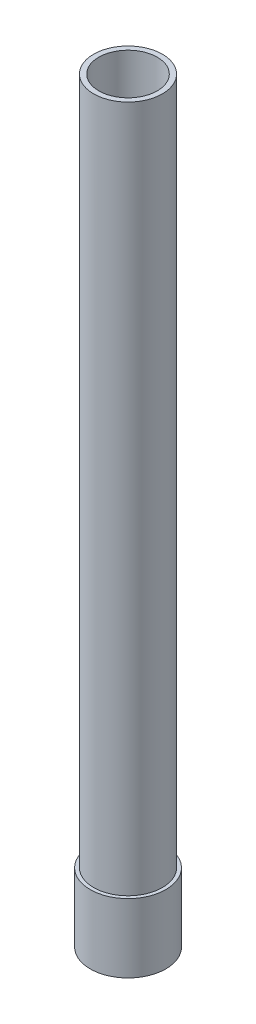
ISO-10303-21;
HEADER;
FILE_DESCRIPTION(('STEP AP214'),'2;1');
FILE_NAME('part.step','',(''),(''),'','','');
FILE_SCHEMA(('AUTOMOTIVE_DESIGN { 1 0 10303 214 1 1 1 1 }'));
ENDSEC;
DATA;
#1=APPLICATION_CONTEXT('core data for automotive mechanical design processes');
#2=APPLICATION_PROTOCOL_DEFINITION('international standard','automotive_design',2000,#1);
#3=PRODUCT_CONTEXT('',#1,'mechanical');
#4=PRODUCT('Part','Part','',(#3));
#5=PRODUCT_RELATED_PRODUCT_CATEGORY('part','',(#4));
#6=PRODUCT_DEFINITION_FORMATION('','',#4);
#7=PRODUCT_DEFINITION_CONTEXT('part definition',#1,'design');
#8=PRODUCT_DEFINITION('design','',#6,#7);
#9=PRODUCT_DEFINITION_SHAPE('','',#8);
#10=(LENGTH_UNIT() NAMED_UNIT(*) SI_UNIT(.MILLI.,.METRE.));
#11=(NAMED_UNIT(*) PLANE_ANGLE_UNIT() SI_UNIT($,.RADIAN.));
#12=(NAMED_UNIT(*) SI_UNIT($,.STERADIAN.) SOLID_ANGLE_UNIT());
#13=UNCERTAINTY_MEASURE_WITH_UNIT(LENGTH_MEASURE(1.E-05),#10,'distance_accuracy_value','');
#14=(GEOMETRIC_REPRESENTATION_CONTEXT(3) GLOBAL_UNCERTAINTY_ASSIGNED_CONTEXT((#13)) GLOBAL_UNIT_ASSIGNED_CONTEXT((#10,
#11,#12)) REPRESENTATION_CONTEXT('',''));
#15=CARTESIAN_POINT('',(0.,0.,0.));
#16=DIRECTION('',(0.,0.,1.));
#17=DIRECTION('',(1.,0.,0.));
#18=AXIS2_PLACEMENT_3D('',#15,#16,#17);
#19=CARTESIAN_POINT('',(0.,200.,0.));
#20=DIRECTION('',(0.,-1.,0.));
#21=DIRECTION('',(0.,0.,-1.));
#22=AXIS2_PLACEMENT_3D('',#19,#20,#21);
#23=CYLINDRICAL_SURFACE('',#22,10.);
#24=CARTESIAN_POINT('',(0.,200.,0.));
#25=DIRECTION('',(0.,1.,0.));
#26=DIRECTION('',(0.,0.,1.));
#27=AXIS2_PLACEMENT_3D('',#24,#25,#26);
#28=CIRCLE('',#27,10.);
#29=CARTESIAN_POINT('',(0.,200.,10.));
#30=VERTEX_POINT('',#29);
#31=EDGE_CURVE('E10',#30,#30,#28,.T.);
#32=ORIENTED_EDGE('',*,*,#31,.F.);
#33=EDGE_LOOP('',(#32));
#34=FACE_BOUND('',#33,.T.);
#35=CARTESIAN_POINT('',(0.,0.,0.));
#36=DIRECTION('',(0.,-1.,0.));
#37=DIRECTION('',(0.,0.,-1.));
#38=AXIS2_PLACEMENT_3D('',#35,#36,#37);
#39=CIRCLE('',#38,10.);
#40=CARTESIAN_POINT('',(0.,0.,-10.));
#41=VERTEX_POINT('',#40);
#42=EDGE_CURVE('E45',#41,#41,#39,.T.);
#43=ORIENTED_EDGE('',*,*,#42,.F.);
#44=EDGE_LOOP('',(#43));
#45=FACE_BOUND('',#44,.T.);
#46=ADVANCED_FACE('F31',(#34,#45),#23,.T.);
#47=CARTESIAN_POINT('',(0.,200.,0.));
#48=DIRECTION('',(0.,1.,0.));
#49=DIRECTION('',(0.,0.,1.));
#50=AXIS2_PLACEMENT_3D('',#47,#48,#49);
#51=PLANE('',#50);
#52=CARTESIAN_POINT('',(0.,200.,0.));
#53=DIRECTION('',(0.,1.,0.));
#54=DIRECTION('',(0.,0.,1.));
#55=AXIS2_PLACEMENT_3D('',#52,#53,#54);
#56=CIRCLE('',#55,8.5);
#57=CARTESIAN_POINT('',(0.,200.,8.5));
#58=VERTEX_POINT('',#57);
#59=EDGE_CURVE('E37',#58,#58,#56,.T.);
#60=ORIENTED_EDGE('',*,*,#59,.F.);
#61=EDGE_LOOP('',(#60));
#62=FACE_BOUND('',#61,.T.);
#63=ORIENTED_EDGE('',*,*,#31,.T.);
#64=EDGE_LOOP('',(#63));
#65=FACE_BOUND('',#64,.T.);
#66=ADVANCED_FACE('F89',(#62,#65),#51,.T.);
#67=CARTESIAN_POINT('',(0.,200.,0.));
#68=DIRECTION('',(0.,-1.,0.));
#69=DIRECTION('',(0.,0.,-1.));
#70=AXIS2_PLACEMENT_3D('',#67,#68,#69);
#71=CYLINDRICAL_SURFACE('',#70,8.5);
#72=ORIENTED_EDGE('',*,*,#59,.T.);
#73=EDGE_LOOP('',(#72));
#74=FACE_BOUND('',#73,.T.);
#75=CARTESIAN_POINT('',(0.,1.5,0.));
#76=DIRECTION('',(0.,1.,0.));
#77=DIRECTION('',(0.,0.,1.));
#78=AXIS2_PLACEMENT_3D('',#75,#76,#77);
#79=CIRCLE('',#78,8.5);
#80=CARTESIAN_POINT('',(0.,1.5,8.5));
#81=VERTEX_POINT('',#80);
#82=EDGE_CURVE('E41',#81,#81,#79,.T.);
#83=ORIENTED_EDGE('',*,*,#82,.F.);
#84=EDGE_LOOP('',(#83));
#85=FACE_BOUND('',#84,.T.);
#86=ADVANCED_FACE('F94',(#74,#85),#71,.F.);
#87=CARTESIAN_POINT('',(0.,1.5,0.));
#88=DIRECTION('',(0.,1.,0.));
#89=DIRECTION('',(0.,0.,1.));
#90=AXIS2_PLACEMENT_3D('',#87,#88,#89);
#91=PLANE('',#90);
#92=ORIENTED_EDGE('',*,*,#82,.T.);
#93=EDGE_LOOP('',(#92));
#94=FACE_BOUND('',#93,.T.);
#95=ADVANCED_FACE('F108',(#94),#91,.T.);
#96=CARTESIAN_POINT('',(0.,-20.,0.));
#97=DIRECTION('',(0.,1.,0.));
#98=DIRECTION('',(0.,0.,1.));
#99=AXIS2_PLACEMENT_3D('',#96,#97,#98);
#100=CYLINDRICAL_SURFACE('',#99,11.);
#101=CARTESIAN_POINT('',(0.,-20.,0.));
#102=DIRECTION('',(0.,-1.,0.));
#103=DIRECTION('',(0.,0.,-1.));
#104=AXIS2_PLACEMENT_3D('',#101,#102,#103);
#105=CIRCLE('',#104,11.);
#106=CARTESIAN_POINT('',(0.,-20.,-11.));
#107=VERTEX_POINT('',#106);
#108=EDGE_CURVE('E50',#107,#107,#105,.T.);
#109=ORIENTED_EDGE('',*,*,#108,.F.);
#110=EDGE_LOOP('',(#109));
#111=FACE_BOUND('',#110,.T.);
#112=CARTESIAN_POINT('',(0.,0.,0.));
#113=DIRECTION('',(0.,-1.,0.));
#114=DIRECTION('',(0.,0.,-1.));
#115=AXIS2_PLACEMENT_3D('',#112,#113,#114);
#116=CIRCLE('',#115,11.);
#117=CARTESIAN_POINT('',(0.,0.,-11.));
#118=VERTEX_POINT('',#117);
#119=EDGE_CURVE('E51',#118,#118,#116,.T.);
#120=ORIENTED_EDGE('',*,*,#119,.T.);
#121=EDGE_LOOP('',(#120));
#122=FACE_BOUND('',#121,.T.);
#123=ADVANCED_FACE('F106',(#111,#122),#100,.T.);
#124=CARTESIAN_POINT('',(0.,-20.,0.));
#125=DIRECTION('',(0.,-1.,0.));
#126=DIRECTION('',(0.,0.,-1.));
#127=AXIS2_PLACEMENT_3D('',#124,#125,#126);
#128=PLANE('',#127);
#129=CARTESIAN_POINT('',(0.,-20.,0.));
#130=DIRECTION('',(0.,-1.,0.));
#131=DIRECTION('',(0.,0.,-1.));
#132=AXIS2_PLACEMENT_3D('',#129,#130,#131);
#133=CIRCLE('',#132,9.5);
#134=CARTESIAN_POINT('',(0.,-20.,-9.5));
#135=VERTEX_POINT('',#134);
#136=EDGE_CURVE('E60',#135,#135,#133,.T.);
#137=ORIENTED_EDGE('',*,*,#136,.F.);
#138=EDGE_LOOP('',(#137));
#139=FACE_BOUND('',#138,.T.);
#140=ORIENTED_EDGE('',*,*,#108,.T.);
#141=EDGE_LOOP('',(#140));
#142=FACE_BOUND('',#141,.T.);
#143=ADVANCED_FACE('F102',(#139,#142),#128,.T.);
#144=CARTESIAN_POINT('',(0.,0.,0.));
#145=DIRECTION('',(0.,-1.,0.));
#146=DIRECTION('',(0.,0.,-1.));
#147=AXIS2_PLACEMENT_3D('',#144,#145,#146);
#148=PLANE('',#147);
#149=ORIENTED_EDGE('',*,*,#42,.T.);
#150=EDGE_LOOP('',(#149));
#151=FACE_BOUND('',#150,.T.);
#152=ORIENTED_EDGE('',*,*,#119,.F.);
#153=EDGE_LOOP('',(#152));
#154=FACE_BOUND('',#153,.T.);
#155=ADVANCED_FACE('F99',(#151,#154),#148,.F.);
#156=CARTESIAN_POINT('',(0.,200.,0.));
#157=DIRECTION('',(0.,-1.,0.));
#158=DIRECTION('',(0.,0.,-1.));
#159=AXIS2_PLACEMENT_3D('',#156,#157,#158);
#160=CYLINDRICAL_SURFACE('',#159,8.5);
#161=CARTESIAN_POINT('',(0.,-1.5,0.));
#162=DIRECTION('',(0.,-1.,0.));
#163=DIRECTION('',(0.,0.,-1.));
#164=AXIS2_PLACEMENT_3D('',#161,#162,#163);
#165=CIRCLE('',#164,8.5);
#166=CARTESIAN_POINT('',(0.,-1.5,-8.5));
#167=VERTEX_POINT('',#166);
#168=EDGE_CURVE('E59',#167,#167,#165,.T.);
#169=ORIENTED_EDGE('',*,*,#168,.T.);
#170=EDGE_LOOP('',(#169));
#171=FACE_BOUND('',#170,.T.);
#172=CARTESIAN_POINT('',(0.,0.,0.));
#173=DIRECTION('',(0.,1.,0.));
#174=DIRECTION('',(0.,0.,1.));
#175=AXIS2_PLACEMENT_3D('',#172,#173,#174);
#176=CIRCLE('',#175,8.5);
#177=CARTESIAN_POINT('',(0.,0.,8.5));
#178=VERTEX_POINT('',#177);
#179=EDGE_CURVE('E54',#178,#178,#176,.F.);
#180=ORIENTED_EDGE('',*,*,#179,.F.);
#181=EDGE_LOOP('',(#180));
#182=FACE_BOUND('',#181,.T.);
#183=ADVANCED_FACE('F69',(#171,#182),#160,.F.);
#184=CARTESIAN_POINT('',(0.,0.,0.));
#185=DIRECTION('',(0.,1.,0.));
#186=DIRECTION('',(0.,0.,1.));
#187=AXIS2_PLACEMENT_3D('',#184,#185,#186);
#188=PLANE('',#187);
#189=ORIENTED_EDGE('',*,*,#179,.T.);
#190=EDGE_LOOP('',(#189));
#191=FACE_BOUND('',#190,.T.);
#192=ADVANCED_FACE('F80',(#191),#188,.F.);
#193=CARTESIAN_POINT('',(0.,-20.,0.));
#194=DIRECTION('',(0.,1.,0.));
#195=DIRECTION('',(0.,0.,1.));
#196=AXIS2_PLACEMENT_3D('',#193,#194,#195);
#197=CYLINDRICAL_SURFACE('',#196,9.5);
#198=ORIENTED_EDGE('',*,*,#136,.T.);
#199=EDGE_LOOP('',(#198));
#200=FACE_BOUND('',#199,.T.);
#201=CARTESIAN_POINT('',(0.,-1.5,0.));
#202=DIRECTION('',(0.,-1.,0.));
#203=DIRECTION('',(0.,0.,-1.));
#204=AXIS2_PLACEMENT_3D('',#201,#202,#203);
#205=CIRCLE('',#204,9.5);
#206=CARTESIAN_POINT('',(0.,-1.5,-9.5));
#207=VERTEX_POINT('',#206);
#208=EDGE_CURVE('E63',#207,#207,#205,.T.);
#209=ORIENTED_EDGE('',*,*,#208,.F.);
#210=EDGE_LOOP('',(#209));
#211=FACE_BOUND('',#210,.T.);
#212=ADVANCED_FACE('F75',(#200,#211),#197,.F.);
#213=CARTESIAN_POINT('',(0.,-1.5,0.));
#214=DIRECTION('',(0.,-1.,0.));
#215=DIRECTION('',(0.,0.,-1.));
#216=AXIS2_PLACEMENT_3D('',#213,#214,#215);
#217=PLANE('',#216);
#218=ORIENTED_EDGE('',*,*,#168,.F.);
#219=EDGE_LOOP('',(#218));
#220=FACE_BOUND('',#219,.T.);
#221=ORIENTED_EDGE('',*,*,#208,.T.);
#222=EDGE_LOOP('',(#221));
#223=FACE_BOUND('',#222,.T.);
#224=ADVANCED_FACE('F72',(#220,#223),#217,.T.);
#225=CLOSED_SHELL('',(#46,#66,#86,#95,#123,#143,#155,#183,#192,#212,#224));
#226=MANIFOLD_SOLID_BREP('B2',#225);
#227=ADVANCED_BREP_SHAPE_REPRESENTATION('',(#18,#226),#14);
#228=SHAPE_DEFINITION_REPRESENTATION(#9,#227);
ENDSEC;
END-ISO-10303-21;
